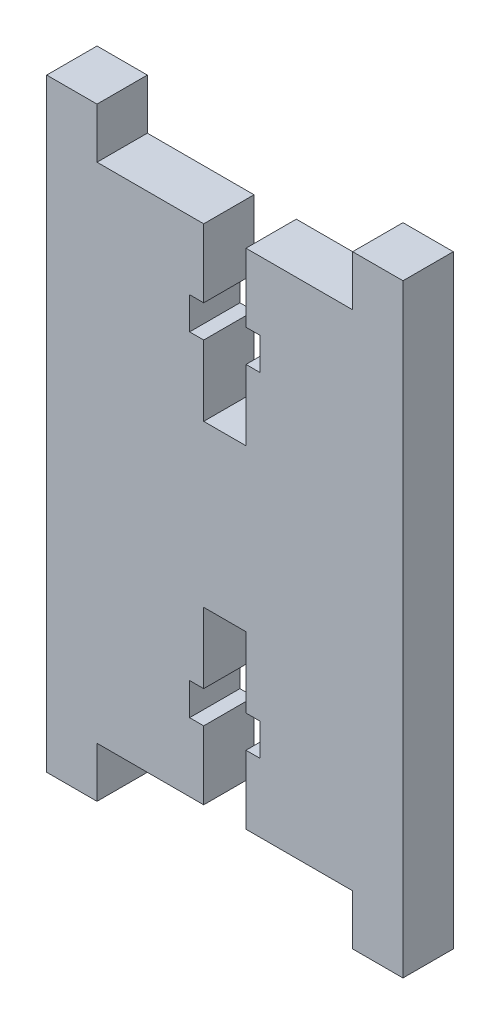
ISO-10303-21;
HEADER;
FILE_DESCRIPTION(('STEP AP214'),'2;1');
FILE_NAME('part.step','',(''),(''),'','','');
FILE_SCHEMA(('AUTOMOTIVE_DESIGN { 1 0 10303 214 1 1 1 1 }'));
ENDSEC;
DATA;
#1=APPLICATION_CONTEXT('core data for automotive mechanical design processes');
#2=APPLICATION_PROTOCOL_DEFINITION('international standard','automotive_design',2000,#1);
#3=PRODUCT_CONTEXT('',#1,'mechanical');
#4=PRODUCT('Part','Part','',(#3));
#5=PRODUCT_RELATED_PRODUCT_CATEGORY('part','',(#4));
#6=PRODUCT_DEFINITION_FORMATION('','',#4);
#7=PRODUCT_DEFINITION_CONTEXT('part definition',#1,'design');
#8=PRODUCT_DEFINITION('design','',#6,#7);
#9=PRODUCT_DEFINITION_SHAPE('','',#8);
#10=(LENGTH_UNIT() NAMED_UNIT(*) SI_UNIT(.MILLI.,.METRE.));
#11=(NAMED_UNIT(*) PLANE_ANGLE_UNIT() SI_UNIT($,.RADIAN.));
#12=(NAMED_UNIT(*) SI_UNIT($,.STERADIAN.) SOLID_ANGLE_UNIT());
#13=UNCERTAINTY_MEASURE_WITH_UNIT(LENGTH_MEASURE(1.E-05),#10,'distance_accuracy_value','');
#14=(GEOMETRIC_REPRESENTATION_CONTEXT(3) GLOBAL_UNCERTAINTY_ASSIGNED_CONTEXT((#13)) GLOBAL_UNIT_ASSIGNED_CONTEXT((#10,
#11,#12)) REPRESENTATION_CONTEXT('',''));
#15=CARTESIAN_POINT('',(0.,0.,0.));
#16=DIRECTION('',(0.,0.,1.));
#17=DIRECTION('',(1.,0.,0.));
#18=AXIS2_PLACEMENT_3D('',#15,#16,#17);
#19=CARTESIAN_POINT('',(-19.8,0.,5.));
#20=DIRECTION('',(-1.,0.,0.));
#21=DIRECTION('',(0.,-1.,0.));
#22=AXIS2_PLACEMENT_3D('',#19,#20,#21);
#23=PLANE('',#22);
#24=DIRECTION('',(0.,1.,0.));
#25=VECTOR('',#24,1.);
#26=CARTESIAN_POINT('',(-19.8,0.,0.));
#27=LINE('',#26,#25);
#28=CARTESIAN_POINT('',(-19.8,0.,0.));
#29=VERTEX_POINT('',#28);
#30=CARTESIAN_POINT('',(-19.8,6.8,0.));
#31=VERTEX_POINT('',#30);
#32=EDGE_CURVE('E390',#29,#31,#27,.T.);
#33=ORIENTED_EDGE('',*,*,#32,.T.);
#34=DIRECTION('',(0.,0.,-1.));
#35=VECTOR('',#34,1.);
#36=CARTESIAN_POINT('',(-19.8,6.8,5.));
#37=LINE('',#36,#35);
#38=CARTESIAN_POINT('',(-19.8,6.8,5.));
#39=VERTEX_POINT('',#38);
#40=EDGE_CURVE('E224',#39,#31,#37,.T.);
#41=ORIENTED_EDGE('',*,*,#40,.F.);
#42=DIRECTION('',(0.,1.,0.));
#43=VECTOR('',#42,1.);
#44=CARTESIAN_POINT('',(-19.8,0.,5.));
#45=LINE('',#44,#43);
#46=CARTESIAN_POINT('',(-19.8,0.,5.));
#47=VERTEX_POINT('',#46);
#48=EDGE_CURVE('E469',#47,#39,#45,.T.);
#49=ORIENTED_EDGE('',*,*,#48,.F.);
#50=DIRECTION('',(0.,0.,-1.));
#51=VECTOR('',#50,1.);
#52=CARTESIAN_POINT('',(-19.8,0.,5.));
#53=LINE('',#52,#51);
#54=EDGE_CURVE('E161',#47,#29,#53,.T.);
#55=ORIENTED_EDGE('',*,*,#54,.T.);
#56=EDGE_LOOP('',(#33,#41,#49,#55));
#57=FACE_BOUND('',#56,.T.);
#58=ADVANCED_FACE('F151',(#57),#23,.F.);
#59=CARTESIAN_POINT('',(0.,6.8,5.));
#60=DIRECTION('',(0.,1.,0.));
#61=DIRECTION('',(0.,0.,1.));
#62=AXIS2_PLACEMENT_3D('',#59,#60,#61);
#63=PLANE('',#62);
#64=DIRECTION('',(1.,0.,0.));
#65=VECTOR('',#64,1.);
#66=CARTESIAN_POINT('',(0.,6.8,0.));
#67=LINE('',#66,#65);
#68=CARTESIAN_POINT('',(-21.2,6.8,0.));
#69=VERTEX_POINT('',#68);
#70=EDGE_CURVE('E387',#69,#31,#67,.T.);
#71=ORIENTED_EDGE('',*,*,#70,.F.);
#72=DIRECTION('',(0.,0.,-1.));
#73=VECTOR('',#72,1.);
#74=CARTESIAN_POINT('',(-21.2,6.8,5.));
#75=LINE('',#74,#73);
#76=CARTESIAN_POINT('',(-21.2,6.8,5.));
#77=VERTEX_POINT('',#76);
#78=EDGE_CURVE('E227',#77,#69,#75,.T.);
#79=ORIENTED_EDGE('',*,*,#78,.F.);
#80=DIRECTION('',(1.,0.,0.));
#81=VECTOR('',#80,1.);
#82=CARTESIAN_POINT('',(0.,6.8,5.));
#83=LINE('',#82,#81);
#84=EDGE_CURVE('E466',#77,#39,#83,.T.);
#85=ORIENTED_EDGE('',*,*,#84,.T.);
#86=ORIENTED_EDGE('',*,*,#40,.T.);
#87=EDGE_LOOP('',(#71,#79,#85,#86));
#88=FACE_BOUND('',#87,.T.);
#89=ADVANCED_FACE('F756',(#88),#63,.T.);
#90=CARTESIAN_POINT('',(-21.2,0.,5.));
#91=DIRECTION('',(-1.,0.,0.));
#92=DIRECTION('',(0.,-1.,0.));
#93=AXIS2_PLACEMENT_3D('',#90,#91,#92);
#94=PLANE('',#93);
#95=DIRECTION('',(0.,1.,0.));
#96=VECTOR('',#95,1.);
#97=CARTESIAN_POINT('',(-21.2,0.,0.));
#98=LINE('',#97,#96);
#99=CARTESIAN_POINT('',(-21.2,10.,0.));
#100=VERTEX_POINT('',#99);
#101=EDGE_CURVE('E384',#69,#100,#98,.T.);
#102=ORIENTED_EDGE('',*,*,#101,.T.);
#103=DIRECTION('',(0.,0.,-1.));
#104=VECTOR('',#103,1.);
#105=CARTESIAN_POINT('',(-21.2,10.,5.));
#106=LINE('',#105,#104);
#107=CARTESIAN_POINT('',(-21.2,10.,5.));
#108=VERTEX_POINT('',#107);
#109=EDGE_CURVE('E230',#108,#100,#106,.T.);
#110=ORIENTED_EDGE('',*,*,#109,.F.);
#111=DIRECTION('',(0.,1.,0.));
#112=VECTOR('',#111,1.);
#113=CARTESIAN_POINT('',(-21.2,0.,5.));
#114=LINE('',#113,#112);
#115=EDGE_CURVE('E463',#77,#108,#114,.T.);
#116=ORIENTED_EDGE('',*,*,#115,.F.);
#117=ORIENTED_EDGE('',*,*,#78,.T.);
#118=EDGE_LOOP('',(#102,#110,#116,#117));
#119=FACE_BOUND('',#118,.T.);
#120=ADVANCED_FACE('F762',(#119),#94,.F.);
#121=CARTESIAN_POINT('',(0.,10.,5.));
#122=DIRECTION('',(0.,1.,0.));
#123=DIRECTION('',(0.,0.,1.));
#124=AXIS2_PLACEMENT_3D('',#121,#122,#123);
#125=PLANE('',#124);
#126=DIRECTION('',(1.,0.,0.));
#127=VECTOR('',#126,1.);
#128=CARTESIAN_POINT('',(0.,10.,0.));
#129=LINE('',#128,#127);
#130=CARTESIAN_POINT('',(-19.8,10.,0.));
#131=VERTEX_POINT('',#130);
#132=EDGE_CURVE('E381',#100,#131,#129,.T.);
#133=ORIENTED_EDGE('',*,*,#132,.T.);
#134=DIRECTION('',(0.,0.,-1.));
#135=VECTOR('',#134,1.);
#136=CARTESIAN_POINT('',(-19.8,10.,5.));
#137=LINE('',#136,#135);
#138=CARTESIAN_POINT('',(-19.8,10.,5.));
#139=VERTEX_POINT('',#138);
#140=EDGE_CURVE('E233',#139,#131,#137,.T.);
#141=ORIENTED_EDGE('',*,*,#140,.F.);
#142=DIRECTION('',(1.,0.,0.));
#143=VECTOR('',#142,1.);
#144=CARTESIAN_POINT('',(0.,10.,5.));
#145=LINE('',#144,#143);
#146=EDGE_CURVE('E460',#108,#139,#145,.T.);
#147=ORIENTED_EDGE('',*,*,#146,.F.);
#148=ORIENTED_EDGE('',*,*,#109,.T.);
#149=EDGE_LOOP('',(#133,#141,#147,#148));
#150=FACE_BOUND('',#149,.T.);
#151=ADVANCED_FACE('F769',(#150),#125,.F.);
#152=CARTESIAN_POINT('',(-19.8,17.,0.));
#153=VERTEX_POINT('',#152);
#154=EDGE_CURVE('E380',#131,#153,#27,.T.);
#155=ORIENTED_EDGE('',*,*,#154,.T.);
#156=DIRECTION('',(0.,0.,-1.));
#157=VECTOR('',#156,1.);
#158=CARTESIAN_POINT('',(-19.8,17.,5.));
#159=LINE('',#158,#157);
#160=CARTESIAN_POINT('',(-19.8,17.,5.));
#161=VERTEX_POINT('',#160);
#162=EDGE_CURVE('E236',#161,#153,#159,.T.);
#163=ORIENTED_EDGE('',*,*,#162,.F.);
#164=EDGE_CURVE('E459',#139,#161,#45,.T.);
#165=ORIENTED_EDGE('',*,*,#164,.F.);
#166=ORIENTED_EDGE('',*,*,#140,.T.);
#167=EDGE_LOOP('',(#155,#163,#165,#166));
#168=FACE_BOUND('',#167,.T.);
#169=ADVANCED_FACE('F758',(#168),#23,.F.);
#170=CARTESIAN_POINT('',(0.,17.,5.));
#171=DIRECTION('',(0.,1.,0.));
#172=DIRECTION('',(0.,0.,1.));
#173=AXIS2_PLACEMENT_3D('',#170,#171,#172);
#174=PLANE('',#173);
#175=DIRECTION('',(1.,0.,0.));
#176=VECTOR('',#175,1.);
#177=CARTESIAN_POINT('',(0.,17.,0.));
#178=LINE('',#177,#176);
#179=CARTESIAN_POINT('',(-15.6,17.,0.));
#180=VERTEX_POINT('',#179);
#181=EDGE_CURVE('E376',#153,#180,#178,.T.);
#182=ORIENTED_EDGE('',*,*,#181,.T.);
#183=DIRECTION('',(0.,0.,-1.));
#184=VECTOR('',#183,1.);
#185=CARTESIAN_POINT('',(-15.6,17.,5.));
#186=LINE('',#185,#184);
#187=CARTESIAN_POINT('',(-15.6,17.,5.));
#188=VERTEX_POINT('',#187);
#189=EDGE_CURVE('E239',#188,#180,#186,.T.);
#190=ORIENTED_EDGE('',*,*,#189,.F.);
#191=DIRECTION('',(1.,0.,0.));
#192=VECTOR('',#191,1.);
#193=CARTESIAN_POINT('',(0.,17.,5.));
#194=LINE('',#193,#192);
#195=EDGE_CURVE('E455',#161,#188,#194,.T.);
#196=ORIENTED_EDGE('',*,*,#195,.F.);
#197=ORIENTED_EDGE('',*,*,#162,.T.);
#198=EDGE_LOOP('',(#182,#190,#196,#197));
#199=FACE_BOUND('',#198,.T.);
#200=ADVANCED_FACE('F768',(#199),#174,.F.);
#201=CARTESIAN_POINT('',(-15.6,0.,5.));
#202=DIRECTION('',(-1.,0.,0.));
#203=DIRECTION('',(0.,-1.,0.));
#204=AXIS2_PLACEMENT_3D('',#201,#202,#203);
#205=PLANE('',#204);
#206=DIRECTION('',(0.,1.,0.));
#207=VECTOR('',#206,1.);
#208=CARTESIAN_POINT('',(-15.6,0.,0.));
#209=LINE('',#208,#207);
#210=CARTESIAN_POINT('',(-15.6,10.,0.));
#211=VERTEX_POINT('',#210);
#212=EDGE_CURVE('E373',#211,#180,#209,.T.);
#213=ORIENTED_EDGE('',*,*,#212,.F.);
#214=DIRECTION('',(0.,0.,-1.));
#215=VECTOR('',#214,1.);
#216=CARTESIAN_POINT('',(-15.6,10.,5.));
#217=LINE('',#216,#215);
#218=CARTESIAN_POINT('',(-15.6,10.,5.));
#219=VERTEX_POINT('',#218);
#220=EDGE_CURVE('E242',#219,#211,#217,.T.);
#221=ORIENTED_EDGE('',*,*,#220,.F.);
#222=DIRECTION('',(0.,1.,0.));
#223=VECTOR('',#222,1.);
#224=CARTESIAN_POINT('',(-15.6,0.,5.));
#225=LINE('',#224,#223);
#226=EDGE_CURVE('E452',#219,#188,#225,.T.);
#227=ORIENTED_EDGE('',*,*,#226,.T.);
#228=ORIENTED_EDGE('',*,*,#189,.T.);
#229=EDGE_LOOP('',(#213,#221,#227,#228));
#230=FACE_BOUND('',#229,.T.);
#231=ADVANCED_FACE('F775',(#230),#205,.T.);
#232=CARTESIAN_POINT('',(-14.2,10.,0.));
#233=VERTEX_POINT('',#232);
#234=EDGE_CURVE('E372',#211,#233,#129,.T.);
#235=ORIENTED_EDGE('',*,*,#234,.T.);
#236=DIRECTION('',(0.,0.,-1.));
#237=VECTOR('',#236,1.);
#238=CARTESIAN_POINT('',(-14.2,10.,5.));
#239=LINE('',#238,#237);
#240=CARTESIAN_POINT('',(-14.2,10.,5.));
#241=VERTEX_POINT('',#240);
#242=EDGE_CURVE('E245',#241,#233,#239,.T.);
#243=ORIENTED_EDGE('',*,*,#242,.F.);
#244=EDGE_CURVE('E451',#219,#241,#145,.T.);
#245=ORIENTED_EDGE('',*,*,#244,.F.);
#246=ORIENTED_EDGE('',*,*,#220,.T.);
#247=EDGE_LOOP('',(#235,#243,#245,#246));
#248=FACE_BOUND('',#247,.T.);
#249=ADVANCED_FACE('F651',(#248),#125,.F.);
#250=CARTESIAN_POINT('',(-14.2,0.,5.));
#251=DIRECTION('',(-1.,0.,0.));
#252=DIRECTION('',(0.,-1.,0.));
#253=AXIS2_PLACEMENT_3D('',#250,#251,#252);
#254=PLANE('',#253);
#255=DIRECTION('',(0.,1.,0.));
#256=VECTOR('',#255,1.);
#257=CARTESIAN_POINT('',(-14.2,0.,0.));
#258=LINE('',#257,#256);
#259=CARTESIAN_POINT('',(-14.2,6.8,0.));
#260=VERTEX_POINT('',#259);
#261=EDGE_CURVE('E368',#260,#233,#258,.T.);
#262=ORIENTED_EDGE('',*,*,#261,.F.);
#263=DIRECTION('',(0.,0.,-1.));
#264=VECTOR('',#263,1.);
#265=CARTESIAN_POINT('',(-14.2,6.8,5.));
#266=LINE('',#265,#264);
#267=CARTESIAN_POINT('',(-14.2,6.8,5.));
#268=VERTEX_POINT('',#267);
#269=EDGE_CURVE('E248',#268,#260,#266,.T.);
#270=ORIENTED_EDGE('',*,*,#269,.F.);
#271=DIRECTION('',(0.,1.,0.));
#272=VECTOR('',#271,1.);
#273=CARTESIAN_POINT('',(-14.2,0.,5.));
#274=LINE('',#273,#272);
#275=EDGE_CURVE('E447',#268,#241,#274,.T.);
#276=ORIENTED_EDGE('',*,*,#275,.T.);
#277=ORIENTED_EDGE('',*,*,#242,.T.);
#278=EDGE_LOOP('',(#262,#270,#276,#277));
#279=FACE_BOUND('',#278,.T.);
#280=ADVANCED_FACE('F654',(#279),#254,.T.);
#281=CARTESIAN_POINT('',(-15.6,6.8,0.));
#282=VERTEX_POINT('',#281);
#283=EDGE_CURVE('E371',#282,#260,#67,.T.);
#284=ORIENTED_EDGE('',*,*,#283,.F.);
#285=DIRECTION('',(0.,0.,-1.));
#286=VECTOR('',#285,1.);
#287=CARTESIAN_POINT('',(-15.6,6.8,5.));
#288=LINE('',#287,#286);
#289=CARTESIAN_POINT('',(-15.6,6.8,5.));
#290=VERTEX_POINT('',#289);
#291=EDGE_CURVE('E251',#290,#282,#288,.T.);
#292=ORIENTED_EDGE('',*,*,#291,.F.);
#293=EDGE_CURVE('E450',#290,#268,#83,.T.);
#294=ORIENTED_EDGE('',*,*,#293,.T.);
#295=ORIENTED_EDGE('',*,*,#269,.T.);
#296=EDGE_LOOP('',(#284,#292,#294,#295));
#297=FACE_BOUND('',#296,.T.);
#298=ADVANCED_FACE('F493',(#297),#63,.T.);
#299=CARTESIAN_POINT('',(-15.6,0.,0.));
#300=VERTEX_POINT('',#299);
#301=EDGE_CURVE('E377',#300,#282,#209,.T.);
#302=ORIENTED_EDGE('',*,*,#301,.F.);
#303=DIRECTION('',(0.,0.,-1.));
#304=VECTOR('',#303,1.);
#305=CARTESIAN_POINT('',(-15.6,0.,5.));
#306=LINE('',#305,#304);
#307=CARTESIAN_POINT('',(-15.6,0.,5.));
#308=VERTEX_POINT('',#307);
#309=EDGE_CURVE('E254',#308,#300,#306,.T.);
#310=ORIENTED_EDGE('',*,*,#309,.F.);
#311=EDGE_CURVE('E456',#308,#290,#225,.T.);
#312=ORIENTED_EDGE('',*,*,#311,.T.);
#313=ORIENTED_EDGE('',*,*,#291,.T.);
#314=EDGE_LOOP('',(#302,#310,#312,#313));
#315=FACE_BOUND('',#314,.T.);
#316=ADVANCED_FACE('F791',(#315),#205,.T.);
#317=CARTESIAN_POINT('',(0.,0.,5.));
#318=DIRECTION('',(0.,1.,0.));
#319=DIRECTION('',(0.,0.,1.));
#320=AXIS2_PLACEMENT_3D('',#317,#318,#319);
#321=PLANE('',#320);
#322=DIRECTION('',(1.,0.,0.));
#323=VECTOR('',#322,1.);
#324=CARTESIAN_POINT('',(0.,0.,0.));
#325=LINE('',#324,#323);
#326=CARTESIAN_POINT('',(-5.,0.,0.));
#327=VERTEX_POINT('',#326);
#328=EDGE_CURVE('E367',#300,#327,#325,.T.);
#329=ORIENTED_EDGE('',*,*,#328,.T.);
#330=DIRECTION('',(0.,0.,-1.));
#331=VECTOR('',#330,1.);
#332=CARTESIAN_POINT('',(-5.,0.,5.));
#333=LINE('',#332,#331);
#334=CARTESIAN_POINT('',(-5.,0.,5.));
#335=VERTEX_POINT('',#334);
#336=EDGE_CURVE('E257',#335,#327,#333,.T.);
#337=ORIENTED_EDGE('',*,*,#336,.F.);
#338=DIRECTION('',(1.,0.,0.));
#339=VECTOR('',#338,1.);
#340=CARTESIAN_POINT('',(0.,0.,5.));
#341=LINE('',#340,#339);
#342=EDGE_CURVE('E446',#308,#335,#341,.T.);
#343=ORIENTED_EDGE('',*,*,#342,.F.);
#344=ORIENTED_EDGE('',*,*,#309,.T.);
#345=EDGE_LOOP('',(#329,#337,#343,#344));
#346=FACE_BOUND('',#345,.T.);
#347=ADVANCED_FACE('F660',(#346),#321,.F.);
#348=CARTESIAN_POINT('',(-5.,0.,5.));
#349=DIRECTION('',(1.,0.,0.));
#350=DIRECTION('',(0.,0.,-1.));
#351=AXIS2_PLACEMENT_3D('',#348,#349,#350);
#352=PLANE('',#351);
#353=DIRECTION('',(0.,-1.,0.));
#354=VECTOR('',#353,1.);
#355=CARTESIAN_POINT('',(-5.,0.,0.));
#356=LINE('',#355,#354);
#357=CARTESIAN_POINT('',(-5.,-5.,0.));
#358=VERTEX_POINT('',#357);
#359=EDGE_CURVE('E364',#327,#358,#356,.T.);
#360=ORIENTED_EDGE('',*,*,#359,.T.);
#361=DIRECTION('',(0.,0.,-1.));
#362=VECTOR('',#361,1.);
#363=CARTESIAN_POINT('',(-5.,-5.,5.));
#364=LINE('',#363,#362);
#365=CARTESIAN_POINT('',(-5.,-5.,5.));
#366=VERTEX_POINT('',#365);
#367=EDGE_CURVE('E260',#366,#358,#364,.T.);
#368=ORIENTED_EDGE('',*,*,#367,.F.);
#369=DIRECTION('',(0.,-1.,0.));
#370=VECTOR('',#369,1.);
#371=CARTESIAN_POINT('',(-5.,0.,5.));
#372=LINE('',#371,#370);
#373=EDGE_CURVE('E443',#335,#366,#372,.T.);
#374=ORIENTED_EDGE('',*,*,#373,.F.);
#375=ORIENTED_EDGE('',*,*,#336,.T.);
#376=EDGE_LOOP('',(#360,#368,#374,#375));
#377=FACE_BOUND('',#376,.T.);
#378=ADVANCED_FACE('F664',(#377),#352,.F.);
#379=CARTESIAN_POINT('',(0.,-5.,5.));
#380=DIRECTION('',(0.,-1.,0.));
#381=DIRECTION('',(0.,0.,-1.));
#382=AXIS2_PLACEMENT_3D('',#379,#380,#381);
#383=PLANE('',#382);
#384=DIRECTION('',(-1.,0.,0.));
#385=VECTOR('',#384,1.);
#386=CARTESIAN_POINT('',(0.,-5.,0.));
#387=LINE('',#386,#385);
#388=CARTESIAN_POINT('',(0.,-5.,0.));
#389=VERTEX_POINT('',#388);
#390=EDGE_CURVE('E361',#389,#358,#387,.T.);
#391=ORIENTED_EDGE('',*,*,#390,.F.);
#392=DIRECTION('',(0.,0.,-1.));
#393=VECTOR('',#392,1.);
#394=CARTESIAN_POINT('',(0.,-5.,5.));
#395=LINE('',#394,#393);
#396=CARTESIAN_POINT('',(0.,-5.,5.));
#397=VERTEX_POINT('',#396);
#398=EDGE_CURVE('E263',#397,#389,#395,.T.);
#399=ORIENTED_EDGE('',*,*,#398,.F.);
#400=DIRECTION('',(-1.,0.,0.));
#401=VECTOR('',#400,1.);
#402=CARTESIAN_POINT('',(0.,-5.,5.));
#403=LINE('',#402,#401);
#404=EDGE_CURVE('E440',#397,#366,#403,.T.);
#405=ORIENTED_EDGE('',*,*,#404,.T.);
#406=ORIENTED_EDGE('',*,*,#367,.T.);
#407=EDGE_LOOP('',(#391,#399,#405,#406));
#408=FACE_BOUND('',#407,.T.);
#409=ADVANCED_FACE('F670',(#408),#383,.T.);
#410=CARTESIAN_POINT('',(0.,0.,5.));
#411=DIRECTION('',(1.,0.,0.));
#412=DIRECTION('',(0.,0.,-1.));
#413=AXIS2_PLACEMENT_3D('',#410,#411,#412);
#414=PLANE('',#413);
#415=DIRECTION('',(0.,-1.,0.));
#416=VECTOR('',#415,1.);
#417=CARTESIAN_POINT('',(0.,0.,0.));
#418=LINE('',#417,#416);
#419=CARTESIAN_POINT('',(0.,55.,0.));
#420=VERTEX_POINT('',#419);
#421=EDGE_CURVE('E358',#420,#389,#418,.T.);
#422=ORIENTED_EDGE('',*,*,#421,.F.);
#423=DIRECTION('',(0.,0.,-1.));
#424=VECTOR('',#423,1.);
#425=CARTESIAN_POINT('',(0.,55.,5.));
#426=LINE('',#425,#424);
#427=CARTESIAN_POINT('',(0.,55.,5.));
#428=VERTEX_POINT('',#427);
#429=EDGE_CURVE('E266',#428,#420,#426,.T.);
#430=ORIENTED_EDGE('',*,*,#429,.F.);
#431=DIRECTION('',(0.,-1.,0.));
#432=VECTOR('',#431,1.);
#433=CARTESIAN_POINT('',(0.,0.,5.));
#434=LINE('',#433,#432);
#435=EDGE_CURVE('E437',#428,#397,#434,.T.);
#436=ORIENTED_EDGE('',*,*,#435,.T.);
#437=ORIENTED_EDGE('',*,*,#398,.T.);
#438=EDGE_LOOP('',(#422,#430,#436,#437));
#439=FACE_BOUND('',#438,.T.);
#440=ADVANCED_FACE('F674',(#439),#414,.T.);
#441=CARTESIAN_POINT('',(0.,55.,5.));
#442=DIRECTION('',(0.,-1.,0.));
#443=DIRECTION('',(0.,0.,-1.));
#444=AXIS2_PLACEMENT_3D('',#441,#442,#443);
#445=PLANE('',#444);
#446=DIRECTION('',(-1.,0.,0.));
#447=VECTOR('',#446,1.);
#448=CARTESIAN_POINT('',(0.,55.,0.));
#449=LINE('',#448,#447);
#450=CARTESIAN_POINT('',(-5.,55.,0.));
#451=VERTEX_POINT('',#450);
#452=EDGE_CURVE('E355',#420,#451,#449,.T.);
#453=ORIENTED_EDGE('',*,*,#452,.T.);
#454=DIRECTION('',(0.,0.,-1.));
#455=VECTOR('',#454,1.);
#456=CARTESIAN_POINT('',(-5.,55.,5.));
#457=LINE('',#456,#455);
#458=CARTESIAN_POINT('',(-5.,55.,5.));
#459=VERTEX_POINT('',#458);
#460=EDGE_CURVE('E269',#459,#451,#457,.T.);
#461=ORIENTED_EDGE('',*,*,#460,.F.);
#462=DIRECTION('',(-1.,0.,0.));
#463=VECTOR('',#462,1.);
#464=CARTESIAN_POINT('',(0.,55.,5.));
#465=LINE('',#464,#463);
#466=EDGE_CURVE('E434',#428,#459,#465,.T.);
#467=ORIENTED_EDGE('',*,*,#466,.F.);
#468=ORIENTED_EDGE('',*,*,#429,.T.);
#469=EDGE_LOOP('',(#453,#461,#467,#468));
#470=FACE_BOUND('',#469,.T.);
#471=ADVANCED_FACE('F678',(#470),#445,.F.);
#472=CARTESIAN_POINT('',(-5.,0.,5.));
#473=DIRECTION('',(-1.,0.,0.));
#474=DIRECTION('',(0.,0.,1.));
#475=AXIS2_PLACEMENT_3D('',#472,#473,#474);
#476=PLANE('',#475);
#477=DIRECTION('',(0.,1.,0.));
#478=VECTOR('',#477,1.);
#479=CARTESIAN_POINT('',(-5.,0.,0.));
#480=LINE('',#479,#478);
#481=CARTESIAN_POINT('',(-5.,50.,0.));
#482=VERTEX_POINT('',#481);
#483=EDGE_CURVE('E352',#482,#451,#480,.T.);
#484=ORIENTED_EDGE('',*,*,#483,.F.);
#485=DIRECTION('',(0.,0.,-1.));
#486=VECTOR('',#485,1.);
#487=CARTESIAN_POINT('',(-5.,50.,5.));
#488=LINE('',#487,#486);
#489=CARTESIAN_POINT('',(-5.,50.,5.));
#490=VERTEX_POINT('',#489);
#491=EDGE_CURVE('E272',#490,#482,#488,.T.);
#492=ORIENTED_EDGE('',*,*,#491,.F.);
#493=DIRECTION('',(0.,1.,0.));
#494=VECTOR('',#493,1.);
#495=CARTESIAN_POINT('',(-5.,0.,5.));
#496=LINE('',#495,#494);
#497=EDGE_CURVE('E431',#490,#459,#496,.T.);
#498=ORIENTED_EDGE('',*,*,#497,.T.);
#499=ORIENTED_EDGE('',*,*,#460,.T.);
#500=EDGE_LOOP('',(#484,#492,#498,#499));
#501=FACE_BOUND('',#500,.T.);
#502=ADVANCED_FACE('F745',(#501),#476,.T.);
#503=CARTESIAN_POINT('',(0.,50.,5.));
#504=DIRECTION('',(0.,1.,0.));
#505=DIRECTION('',(0.,0.,1.));
#506=AXIS2_PLACEMENT_3D('',#503,#504,#505);
#507=PLANE('',#506);
#508=DIRECTION('',(1.,0.,0.));
#509=VECTOR('',#508,1.);
#510=CARTESIAN_POINT('',(0.,50.,0.));
#511=LINE('',#510,#509);
#512=CARTESIAN_POINT('',(-15.6,50.,0.));
#513=VERTEX_POINT('',#512);
#514=EDGE_CURVE('E349',#513,#482,#511,.T.);
#515=ORIENTED_EDGE('',*,*,#514,.F.);
#516=DIRECTION('',(0.,0.,-1.));
#517=VECTOR('',#516,1.);
#518=CARTESIAN_POINT('',(-15.6,50.,5.));
#519=LINE('',#518,#517);
#520=CARTESIAN_POINT('',(-15.6,50.,5.));
#521=VERTEX_POINT('',#520);
#522=EDGE_CURVE('E275',#521,#513,#519,.T.);
#523=ORIENTED_EDGE('',*,*,#522,.F.);
#524=DIRECTION('',(1.,0.,0.));
#525=VECTOR('',#524,1.);
#526=CARTESIAN_POINT('',(0.,50.,5.));
#527=LINE('',#526,#525);
#528=EDGE_CURVE('E428',#521,#490,#527,.T.);
#529=ORIENTED_EDGE('',*,*,#528,.T.);
#530=ORIENTED_EDGE('',*,*,#491,.T.);
#531=EDGE_LOOP('',(#515,#523,#529,#530));
#532=FACE_BOUND('',#531,.T.);
#533=ADVANCED_FACE('F684',(#532),#507,.T.);
#534=CARTESIAN_POINT('',(-15.6,0.,5.));
#535=DIRECTION('',(1.,0.,0.));
#536=DIRECTION('',(0.,1.,0.));
#537=AXIS2_PLACEMENT_3D('',#534,#535,#536);
#538=PLANE('',#537);
#539=DIRECTION('',(0.,-1.,0.));
#540=VECTOR('',#539,1.);
#541=CARTESIAN_POINT('',(-15.6,0.,0.));
#542=LINE('',#541,#540);
#543=CARTESIAN_POINT('',(-15.6,43.2,0.));
#544=VERTEX_POINT('',#543);
#545=EDGE_CURVE('E346',#513,#544,#542,.T.);
#546=ORIENTED_EDGE('',*,*,#545,.T.);
#547=DIRECTION('',(0.,0.,-1.));
#548=VECTOR('',#547,1.);
#549=CARTESIAN_POINT('',(-15.6,43.2,5.));
#550=LINE('',#549,#548);
#551=CARTESIAN_POINT('',(-15.6,43.2,5.));
#552=VERTEX_POINT('',#551);
#553=EDGE_CURVE('E278',#552,#544,#550,.T.);
#554=ORIENTED_EDGE('',*,*,#553,.F.);
#555=DIRECTION('',(0.,-1.,0.));
#556=VECTOR('',#555,1.);
#557=CARTESIAN_POINT('',(-15.6,0.,5.));
#558=LINE('',#557,#556);
#559=EDGE_CURVE('E425',#521,#552,#558,.T.);
#560=ORIENTED_EDGE('',*,*,#559,.F.);
#561=ORIENTED_EDGE('',*,*,#522,.T.);
#562=EDGE_LOOP('',(#546,#554,#560,#561));
#563=FACE_BOUND('',#562,.T.);
#564=ADVANCED_FACE('F690',(#563),#538,.F.);
#565=CARTESIAN_POINT('',(0.,43.2,5.));
#566=DIRECTION('',(0.,1.,0.));
#567=DIRECTION('',(0.,0.,1.));
#568=AXIS2_PLACEMENT_3D('',#565,#566,#567);
#569=PLANE('',#568);
#570=DIRECTION('',(1.,0.,0.));
#571=VECTOR('',#570,1.);
#572=CARTESIAN_POINT('',(0.,43.2,0.));
#573=LINE('',#572,#571);
#574=CARTESIAN_POINT('',(-14.2,43.2,0.));
#575=VERTEX_POINT('',#574);
#576=EDGE_CURVE('E343',#544,#575,#573,.T.);
#577=ORIENTED_EDGE('',*,*,#576,.T.);
#578=DIRECTION('',(0.,0.,-1.));
#579=VECTOR('',#578,1.);
#580=CARTESIAN_POINT('',(-14.2,43.2,5.));
#581=LINE('',#580,#579);
#582=CARTESIAN_POINT('',(-14.2,43.2,5.));
#583=VERTEX_POINT('',#582);
#584=EDGE_CURVE('E281',#583,#575,#581,.T.);
#585=ORIENTED_EDGE('',*,*,#584,.F.);
#586=DIRECTION('',(1.,0.,0.));
#587=VECTOR('',#586,1.);
#588=CARTESIAN_POINT('',(0.,43.2,5.));
#589=LINE('',#588,#587);
#590=EDGE_CURVE('E422',#552,#583,#589,.T.);
#591=ORIENTED_EDGE('',*,*,#590,.F.);
#592=ORIENTED_EDGE('',*,*,#553,.T.);
#593=EDGE_LOOP('',(#577,#585,#591,#592));
#594=FACE_BOUND('',#593,.T.);
#595=ADVANCED_FACE('F697',(#594),#569,.F.);
#596=CARTESIAN_POINT('',(-14.2,0.,5.));
#597=DIRECTION('',(1.,0.,0.));
#598=DIRECTION('',(0.,1.,0.));
#599=AXIS2_PLACEMENT_3D('',#596,#597,#598);
#600=PLANE('',#599);
#601=DIRECTION('',(0.,-1.,0.));
#602=VECTOR('',#601,1.);
#603=CARTESIAN_POINT('',(-14.2,0.,0.));
#604=LINE('',#603,#602);
#605=CARTESIAN_POINT('',(-14.2,40.,0.));
#606=VERTEX_POINT('',#605);
#607=EDGE_CURVE('E340',#575,#606,#604,.T.);
#608=ORIENTED_EDGE('',*,*,#607,.T.);
#609=DIRECTION('',(0.,0.,-1.));
#610=VECTOR('',#609,1.);
#611=CARTESIAN_POINT('',(-14.2,40.,5.));
#612=LINE('',#611,#610);
#613=CARTESIAN_POINT('',(-14.2,40.,5.));
#614=VERTEX_POINT('',#613);
#615=EDGE_CURVE('E284',#614,#606,#612,.T.);
#616=ORIENTED_EDGE('',*,*,#615,.F.);
#617=DIRECTION('',(0.,-1.,0.));
#618=VECTOR('',#617,1.);
#619=CARTESIAN_POINT('',(-14.2,0.,5.));
#620=LINE('',#619,#618);
#621=EDGE_CURVE('E419',#583,#614,#620,.T.);
#622=ORIENTED_EDGE('',*,*,#621,.F.);
#623=ORIENTED_EDGE('',*,*,#584,.T.);
#624=EDGE_LOOP('',(#608,#616,#622,#623));
#625=FACE_BOUND('',#624,.T.);
#626=ADVANCED_FACE('F701',(#625),#600,.F.);
#627=CARTESIAN_POINT('',(0.,40.,5.));
#628=DIRECTION('',(0.,1.,0.));
#629=DIRECTION('',(0.,0.,1.));
#630=AXIS2_PLACEMENT_3D('',#627,#628,#629);
#631=PLANE('',#630);
#632=DIRECTION('',(1.,0.,0.));
#633=VECTOR('',#632,1.);
#634=CARTESIAN_POINT('',(0.,40.,0.));
#635=LINE('',#634,#633);
#636=CARTESIAN_POINT('',(-15.6,40.,0.));
#637=VERTEX_POINT('',#636);
#638=EDGE_CURVE('E337',#637,#606,#635,.T.);
#639=ORIENTED_EDGE('',*,*,#638,.F.);
#640=DIRECTION('',(0.,0.,-1.));
#641=VECTOR('',#640,1.);
#642=CARTESIAN_POINT('',(-15.6,40.,5.));
#643=LINE('',#642,#641);
#644=CARTESIAN_POINT('',(-15.6,40.,5.));
#645=VERTEX_POINT('',#644);
#646=EDGE_CURVE('E287',#645,#637,#643,.T.);
#647=ORIENTED_EDGE('',*,*,#646,.F.);
#648=DIRECTION('',(1.,0.,0.));
#649=VECTOR('',#648,1.);
#650=CARTESIAN_POINT('',(0.,40.,5.));
#651=LINE('',#650,#649);
#652=EDGE_CURVE('E416',#645,#614,#651,.T.);
#653=ORIENTED_EDGE('',*,*,#652,.T.);
#654=ORIENTED_EDGE('',*,*,#615,.T.);
#655=EDGE_LOOP('',(#639,#647,#653,#654));
#656=FACE_BOUND('',#655,.T.);
#657=ADVANCED_FACE('F704',(#656),#631,.T.);
#658=CARTESIAN_POINT('',(-15.6,33.,0.));
#659=VERTEX_POINT('',#658);
#660=EDGE_CURVE('E336',#637,#659,#542,.T.);
#661=ORIENTED_EDGE('',*,*,#660,.T.);
#662=DIRECTION('',(0.,0.,-1.));
#663=VECTOR('',#662,1.);
#664=CARTESIAN_POINT('',(-15.6,33.,5.));
#665=LINE('',#664,#663);
#666=CARTESIAN_POINT('',(-15.6,33.,5.));
#667=VERTEX_POINT('',#666);
#668=EDGE_CURVE('E290',#667,#659,#665,.T.);
#669=ORIENTED_EDGE('',*,*,#668,.F.);
#670=EDGE_CURVE('E415',#645,#667,#558,.T.);
#671=ORIENTED_EDGE('',*,*,#670,.F.);
#672=ORIENTED_EDGE('',*,*,#646,.T.);
#673=EDGE_LOOP('',(#661,#669,#671,#672));
#674=FACE_BOUND('',#673,.T.);
#675=ADVANCED_FACE('F711',(#674),#538,.F.);
#676=CARTESIAN_POINT('',(0.,33.,5.));
#677=DIRECTION('',(0.,1.,0.));
#678=DIRECTION('',(0.,0.,1.));
#679=AXIS2_PLACEMENT_3D('',#676,#677,#678);
#680=PLANE('',#679);
#681=DIRECTION('',(1.,0.,0.));
#682=VECTOR('',#681,1.);
#683=CARTESIAN_POINT('',(0.,33.,0.));
#684=LINE('',#683,#682);
#685=CARTESIAN_POINT('',(-19.8,33.,0.));
#686=VERTEX_POINT('',#685);
#687=EDGE_CURVE('E332',#686,#659,#684,.T.);
#688=ORIENTED_EDGE('',*,*,#687,.F.);
#689=DIRECTION('',(0.,0.,-1.));
#690=VECTOR('',#689,1.);
#691=CARTESIAN_POINT('',(-19.8,33.,5.));
#692=LINE('',#691,#690);
#693=CARTESIAN_POINT('',(-19.8,33.,5.));
#694=VERTEX_POINT('',#693);
#695=EDGE_CURVE('E293',#694,#686,#692,.T.);
#696=ORIENTED_EDGE('',*,*,#695,.F.);
#697=DIRECTION('',(1.,0.,0.));
#698=VECTOR('',#697,1.);
#699=CARTESIAN_POINT('',(0.,33.,5.));
#700=LINE('',#699,#698);
#701=EDGE_CURVE('E411',#694,#667,#700,.T.);
#702=ORIENTED_EDGE('',*,*,#701,.T.);
#703=ORIENTED_EDGE('',*,*,#668,.T.);
#704=EDGE_LOOP('',(#688,#696,#702,#703));
#705=FACE_BOUND('',#704,.T.);
#706=ADVANCED_FACE('F715',(#705),#680,.T.);
#707=CARTESIAN_POINT('',(-19.8,0.,5.));
#708=DIRECTION('',(1.,0.,0.));
#709=DIRECTION('',(0.,1.,0.));
#710=AXIS2_PLACEMENT_3D('',#707,#708,#709);
#711=PLANE('',#710);
#712=DIRECTION('',(0.,-1.,0.));
#713=VECTOR('',#712,1.);
#714=CARTESIAN_POINT('',(-19.8,0.,0.));
#715=LINE('',#714,#713);
#716=CARTESIAN_POINT('',(-19.8,40.,0.));
#717=VERTEX_POINT('',#716);
#718=EDGE_CURVE('E329',#717,#686,#715,.T.);
#719=ORIENTED_EDGE('',*,*,#718,.F.);
#720=DIRECTION('',(0.,0.,-1.));
#721=VECTOR('',#720,1.);
#722=CARTESIAN_POINT('',(-19.8,40.,5.));
#723=LINE('',#722,#721);
#724=CARTESIAN_POINT('',(-19.8,40.,5.));
#725=VERTEX_POINT('',#724);
#726=EDGE_CURVE('E296',#725,#717,#723,.T.);
#727=ORIENTED_EDGE('',*,*,#726,.F.);
#728=DIRECTION('',(0.,-1.,0.));
#729=VECTOR('',#728,1.);
#730=CARTESIAN_POINT('',(-19.8,0.,5.));
#731=LINE('',#730,#729);
#732=EDGE_CURVE('E408',#725,#694,#731,.T.);
#733=ORIENTED_EDGE('',*,*,#732,.T.);
#734=ORIENTED_EDGE('',*,*,#695,.T.);
#735=EDGE_LOOP('',(#719,#727,#733,#734));
#736=FACE_BOUND('',#735,.T.);
#737=ADVANCED_FACE('F718',(#736),#711,.T.);
#738=CARTESIAN_POINT('',(-21.2,40.,0.));
#739=VERTEX_POINT('',#738);
#740=EDGE_CURVE('E328',#739,#717,#635,.T.);
#741=ORIENTED_EDGE('',*,*,#740,.F.);
#742=DIRECTION('',(0.,0.,-1.));
#743=VECTOR('',#742,1.);
#744=CARTESIAN_POINT('',(-21.2,40.,5.));
#745=LINE('',#744,#743);
#746=CARTESIAN_POINT('',(-21.2,40.,5.));
#747=VERTEX_POINT('',#746);
#748=EDGE_CURVE('E299',#747,#739,#745,.T.);
#749=ORIENTED_EDGE('',*,*,#748,.F.);
#750=EDGE_CURVE('E407',#747,#725,#651,.T.);
#751=ORIENTED_EDGE('',*,*,#750,.T.);
#752=ORIENTED_EDGE('',*,*,#726,.T.);
#753=EDGE_LOOP('',(#741,#749,#751,#752));
#754=FACE_BOUND('',#753,.T.);
#755=ADVANCED_FACE('F725',(#754),#631,.T.);
#756=CARTESIAN_POINT('',(-21.2000000000001,0.,5.));
#757=DIRECTION('',(1.,0.,0.));
#758=DIRECTION('',(0.,1.,0.));
#759=AXIS2_PLACEMENT_3D('',#756,#757,#758);
#760=PLANE('',#759);
#761=DIRECTION('',(0.,-1.,0.));
#762=VECTOR('',#761,1.);
#763=CARTESIAN_POINT('',(-21.2000000000001,0.,0.));
#764=LINE('',#763,#762);
#765=CARTESIAN_POINT('',(-21.2,43.2,0.));
#766=VERTEX_POINT('',#765);
#767=EDGE_CURVE('E324',#766,#739,#764,.T.);
#768=ORIENTED_EDGE('',*,*,#767,.F.);
#769=DIRECTION('',(0.,0.,-1.));
#770=VECTOR('',#769,1.);
#771=CARTESIAN_POINT('',(-21.2,43.2,5.));
#772=LINE('',#771,#770);
#773=CARTESIAN_POINT('',(-21.2,43.2,5.));
#774=VERTEX_POINT('',#773);
#775=EDGE_CURVE('E302',#774,#766,#772,.T.);
#776=ORIENTED_EDGE('',*,*,#775,.F.);
#777=DIRECTION('',(0.,-1.,0.));
#778=VECTOR('',#777,1.);
#779=CARTESIAN_POINT('',(-21.2000000000001,0.,5.));
#780=LINE('',#779,#778);
#781=EDGE_CURVE('E403',#774,#747,#780,.T.);
#782=ORIENTED_EDGE('',*,*,#781,.T.);
#783=ORIENTED_EDGE('',*,*,#748,.T.);
#784=EDGE_LOOP('',(#768,#776,#782,#783));
#785=FACE_BOUND('',#784,.T.);
#786=ADVANCED_FACE('F728',(#785),#760,.T.);
#787=CARTESIAN_POINT('',(-19.8,43.2,0.));
#788=VERTEX_POINT('',#787);
#789=EDGE_CURVE('E327',#766,#788,#573,.T.);
#790=ORIENTED_EDGE('',*,*,#789,.T.);
#791=DIRECTION('',(0.,0.,-1.));
#792=VECTOR('',#791,1.);
#793=CARTESIAN_POINT('',(-19.8,43.2,5.));
#794=LINE('',#793,#792);
#795=CARTESIAN_POINT('',(-19.8,43.2,5.));
#796=VERTEX_POINT('',#795);
#797=EDGE_CURVE('E305',#796,#788,#794,.T.);
#798=ORIENTED_EDGE('',*,*,#797,.F.);
#799=EDGE_CURVE('E406',#774,#796,#589,.T.);
#800=ORIENTED_EDGE('',*,*,#799,.F.);
#801=ORIENTED_EDGE('',*,*,#775,.T.);
#802=EDGE_LOOP('',(#790,#798,#800,#801));
#803=FACE_BOUND('',#802,.T.);
#804=ADVANCED_FACE('F736',(#803),#569,.F.);
#805=CARTESIAN_POINT('',(-19.8,50.,0.));
#806=VERTEX_POINT('',#805);
#807=EDGE_CURVE('E333',#806,#788,#715,.T.);
#808=ORIENTED_EDGE('',*,*,#807,.F.);
#809=DIRECTION('',(0.,0.,-1.));
#810=VECTOR('',#809,1.);
#811=CARTESIAN_POINT('',(-19.8,50.,5.));
#812=LINE('',#811,#810);
#813=CARTESIAN_POINT('',(-19.8,50.,5.));
#814=VERTEX_POINT('',#813);
#815=EDGE_CURVE('E308',#814,#806,#812,.T.);
#816=ORIENTED_EDGE('',*,*,#815,.F.);
#817=EDGE_CURVE('E412',#814,#796,#731,.T.);
#818=ORIENTED_EDGE('',*,*,#817,.T.);
#819=ORIENTED_EDGE('',*,*,#797,.T.);
#820=EDGE_LOOP('',(#808,#816,#818,#819));
#821=FACE_BOUND('',#820,.T.);
#822=ADVANCED_FACE('F742',(#821),#711,.T.);
#823=CARTESIAN_POINT('',(-30.4,50.,0.));
#824=VERTEX_POINT('',#823);
#825=EDGE_CURVE('E205',#824,#806,#511,.T.);
#826=ORIENTED_EDGE('',*,*,#825,.F.);
#827=DIRECTION('',(0.,0.,1.));
#828=VECTOR('',#827,1.);
#829=CARTESIAN_POINT('',(-30.4,50.,5.));
#830=LINE('',#829,#828);
#831=CARTESIAN_POINT('',(-30.4,50.,5.));
#832=VERTEX_POINT('',#831);
#833=EDGE_CURVE('E12',#824,#832,#830,.T.);
#834=ORIENTED_EDGE('',*,*,#833,.T.);
#835=EDGE_CURVE('E402',#832,#814,#527,.T.);
#836=ORIENTED_EDGE('',*,*,#835,.T.);
#837=ORIENTED_EDGE('',*,*,#815,.T.);
#838=EDGE_LOOP('',(#826,#834,#836,#837));
#839=FACE_BOUND('',#838,.T.);
#840=ADVANCED_FACE('F743',(#839),#507,.T.);
#841=CARTESIAN_POINT('',(-35.4,0.,5.));
#842=DIRECTION('',(1.,0.,0.));
#843=DIRECTION('',(0.,1.,0.));
#844=AXIS2_PLACEMENT_3D('',#841,#842,#843);
#845=PLANE('',#844);
#846=DIRECTION('',(0.,-1.,0.));
#847=VECTOR('',#846,1.);
#848=CARTESIAN_POINT('',(-35.4,0.,0.));
#849=LINE('',#848,#847);
#850=CARTESIAN_POINT('',(-35.4,55.,0.));
#851=VERTEX_POINT('',#850);
#852=CARTESIAN_POINT('',(-35.4,-5.,0.));
#853=VERTEX_POINT('',#852);
#854=EDGE_CURVE('E192',#851,#853,#849,.T.);
#855=ORIENTED_EDGE('',*,*,#854,.T.);
#856=DIRECTION('',(0.,0.,-1.));
#857=VECTOR('',#856,1.);
#858=CARTESIAN_POINT('',(-35.4,-5.,5.));
#859=LINE('',#858,#857);
#860=CARTESIAN_POINT('',(-35.4,-5.,5.));
#861=VERTEX_POINT('',#860);
#862=EDGE_CURVE('E311',#861,#853,#859,.T.);
#863=ORIENTED_EDGE('',*,*,#862,.F.);
#864=DIRECTION('',(0.,-1.,0.));
#865=VECTOR('',#864,1.);
#866=CARTESIAN_POINT('',(-35.4,0.,5.));
#867=LINE('',#866,#865);
#868=CARTESIAN_POINT('',(-35.4,55.,5.));
#869=VERTEX_POINT('',#868);
#870=EDGE_CURVE('E211',#869,#861,#867,.T.);
#871=ORIENTED_EDGE('',*,*,#870,.F.);
#872=DIRECTION('',(0.,0.,-1.));
#873=VECTOR('',#872,1.);
#874=CARTESIAN_POINT('',(-35.4,55.,5.));
#875=LINE('',#874,#873);
#876=EDGE_CURVE('E208',#869,#851,#875,.T.);
#877=ORIENTED_EDGE('',*,*,#876,.T.);
#878=EDGE_LOOP('',(#855,#863,#871,#877));
#879=FACE_BOUND('',#878,.T.);
#880=ADVANCED_FACE('F209',(#879),#845,.F.);
#881=CARTESIAN_POINT('',(0.,-5.,5.));
#882=DIRECTION('',(0.,1.,0.));
#883=DIRECTION('',(0.,0.,1.));
#884=AXIS2_PLACEMENT_3D('',#881,#882,#883);
#885=PLANE('',#884);
#886=DIRECTION('',(1.,0.,0.));
#887=VECTOR('',#886,1.);
#888=CARTESIAN_POINT('',(0.,-5.,0.));
#889=LINE('',#888,#887);
#890=CARTESIAN_POINT('',(-30.4,-5.,0.));
#891=VERTEX_POINT('',#890);
#892=EDGE_CURVE('E201',#853,#891,#889,.T.);
#893=ORIENTED_EDGE('',*,*,#892,.T.);
#894=DIRECTION('',(0.,0.,-1.));
#895=VECTOR('',#894,1.);
#896=CARTESIAN_POINT('',(-30.4,-5.,5.));
#897=LINE('',#896,#895);
#898=CARTESIAN_POINT('',(-30.4,-5.,5.));
#899=VERTEX_POINT('',#898);
#900=EDGE_CURVE('E313',#899,#891,#897,.T.);
#901=ORIENTED_EDGE('',*,*,#900,.F.);
#902=DIRECTION('',(1.,0.,0.));
#903=VECTOR('',#902,1.);
#904=CARTESIAN_POINT('',(0.,-5.,5.));
#905=LINE('',#904,#903);
#906=EDGE_CURVE('E398',#861,#899,#905,.T.);
#907=ORIENTED_EDGE('',*,*,#906,.F.);
#908=ORIENTED_EDGE('',*,*,#862,.T.);
#909=EDGE_LOOP('',(#893,#901,#907,#908));
#910=FACE_BOUND('',#909,.T.);
#911=ADVANCED_FACE('F870',(#910),#885,.F.);
#912=CARTESIAN_POINT('',(-30.4,0.,5.));
#913=DIRECTION('',(1.,0.,0.));
#914=DIRECTION('',(0.,0.,-1.));
#915=AXIS2_PLACEMENT_3D('',#912,#913,#914);
#916=PLANE('',#915);
#917=DIRECTION('',(0.,-1.,0.));
#918=VECTOR('',#917,1.);
#919=CARTESIAN_POINT('',(-30.4,0.,0.));
#920=LINE('',#919,#918);
#921=CARTESIAN_POINT('',(-30.4,0.,0.));
#922=VERTEX_POINT('',#921);
#923=EDGE_CURVE('E320',#922,#891,#920,.T.);
#924=ORIENTED_EDGE('',*,*,#923,.F.);
#925=DIRECTION('',(0.,0.,-1.));
#926=VECTOR('',#925,1.);
#927=CARTESIAN_POINT('',(-30.4,0.,5.));
#928=LINE('',#927,#926);
#929=CARTESIAN_POINT('',(-30.4,0.,5.));
#930=VERTEX_POINT('',#929);
#931=EDGE_CURVE('E316',#930,#922,#928,.T.);
#932=ORIENTED_EDGE('',*,*,#931,.F.);
#933=DIRECTION('',(0.,-1.,0.));
#934=VECTOR('',#933,1.);
#935=CARTESIAN_POINT('',(-30.4,0.,5.));
#936=LINE('',#935,#934);
#937=EDGE_CURVE('E319',#930,#899,#936,.T.);
#938=ORIENTED_EDGE('',*,*,#937,.T.);
#939=ORIENTED_EDGE('',*,*,#900,.T.);
#940=EDGE_LOOP('',(#924,#932,#938,#939));
#941=FACE_BOUND('',#940,.T.);
#942=ADVANCED_FACE('F867',(#941),#916,.T.);
#943=EDGE_CURVE('E393',#922,#29,#325,.T.);
#944=ORIENTED_EDGE('',*,*,#943,.T.);
#945=ORIENTED_EDGE('',*,*,#54,.F.);
#946=EDGE_CURVE('E322',#930,#47,#341,.T.);
#947=ORIENTED_EDGE('',*,*,#946,.F.);
#948=ORIENTED_EDGE('',*,*,#931,.T.);
#949=EDGE_LOOP('',(#944,#945,#947,#948));
#950=FACE_BOUND('',#949,.T.);
#951=ADVANCED_FACE('F801',(#950),#321,.F.);
#952=CARTESIAN_POINT('',(0.,0.,0.));
#953=DIRECTION('',(0.,0.,1.));
#954=DIRECTION('',(1.,0.,0.));
#955=AXIS2_PLACEMENT_3D('',#952,#953,#954);
#956=PLANE('',#955);
#957=ORIENTED_EDGE('',*,*,#943,.F.);
#958=ORIENTED_EDGE('',*,*,#923,.T.);
#959=ORIENTED_EDGE('',*,*,#892,.F.);
#960=ORIENTED_EDGE('',*,*,#854,.F.);
#961=DIRECTION('',(1.,0.,0.));
#962=VECTOR('',#961,1.);
#963=CARTESIAN_POINT('',(-35.4,55.,0.));
#964=LINE('',#963,#962);
#965=CARTESIAN_POINT('',(-30.4,55.,0.));
#966=VERTEX_POINT('',#965);
#967=EDGE_CURVE('E197',#851,#966,#964,.T.);
#968=ORIENTED_EDGE('',*,*,#967,.T.);
#969=DIRECTION('',(0.,1.,0.));
#970=VECTOR('',#969,1.);
#971=CARTESIAN_POINT('',(-30.4,50.,0.));
#972=LINE('',#971,#970);
#973=EDGE_CURVE('E216',#824,#966,#972,.T.);
#974=ORIENTED_EDGE('',*,*,#973,.F.);
#975=ORIENTED_EDGE('',*,*,#825,.T.);
#976=ORIENTED_EDGE('',*,*,#807,.T.);
#977=ORIENTED_EDGE('',*,*,#789,.F.);
#978=ORIENTED_EDGE('',*,*,#767,.T.);
#979=ORIENTED_EDGE('',*,*,#740,.T.);
#980=ORIENTED_EDGE('',*,*,#718,.T.);
#981=ORIENTED_EDGE('',*,*,#687,.T.);
#982=ORIENTED_EDGE('',*,*,#660,.F.);
#983=ORIENTED_EDGE('',*,*,#638,.T.);
#984=ORIENTED_EDGE('',*,*,#607,.F.);
#985=ORIENTED_EDGE('',*,*,#576,.F.);
#986=ORIENTED_EDGE('',*,*,#545,.F.);
#987=ORIENTED_EDGE('',*,*,#514,.T.);
#988=ORIENTED_EDGE('',*,*,#483,.T.);
#989=ORIENTED_EDGE('',*,*,#452,.F.);
#990=ORIENTED_EDGE('',*,*,#421,.T.);
#991=ORIENTED_EDGE('',*,*,#390,.T.);
#992=ORIENTED_EDGE('',*,*,#359,.F.);
#993=ORIENTED_EDGE('',*,*,#328,.F.);
#994=ORIENTED_EDGE('',*,*,#301,.T.);
#995=ORIENTED_EDGE('',*,*,#283,.T.);
#996=ORIENTED_EDGE('',*,*,#261,.T.);
#997=ORIENTED_EDGE('',*,*,#234,.F.);
#998=ORIENTED_EDGE('',*,*,#212,.T.);
#999=ORIENTED_EDGE('',*,*,#181,.F.);
#1000=ORIENTED_EDGE('',*,*,#154,.F.);
#1001=ORIENTED_EDGE('',*,*,#132,.F.);
#1002=ORIENTED_EDGE('',*,*,#101,.F.);
#1003=ORIENTED_EDGE('',*,*,#70,.T.);
#1004=ORIENTED_EDGE('',*,*,#32,.F.);
#1005=EDGE_LOOP('',(#957,#958,#959,#960,#968,#974,#975,#976,#977,#978,#979,#980,#981,#982,#983,
#984,#985,#986,#987,#988,#989,#990,#991,#992,#993,#994,#995,#996,#997,#998,#999,#1000,#1001,
#1002,#1003,#1004));
#1006=FACE_BOUND('',#1005,.T.);
#1007=ADVANCED_FACE('F195',(#1006),#956,.F.);
#1008=CARTESIAN_POINT('',(0.,0.,5.));
#1009=DIRECTION('',(0.,0.,1.));
#1010=DIRECTION('',(1.,0.,0.));
#1011=AXIS2_PLACEMENT_3D('',#1008,#1009,#1010);
#1012=PLANE('',#1011);
#1013=ORIENTED_EDGE('',*,*,#946,.T.);
#1014=ORIENTED_EDGE('',*,*,#48,.T.);
#1015=ORIENTED_EDGE('',*,*,#84,.F.);
#1016=ORIENTED_EDGE('',*,*,#115,.T.);
#1017=ORIENTED_EDGE('',*,*,#146,.T.);
#1018=ORIENTED_EDGE('',*,*,#164,.T.);
#1019=ORIENTED_EDGE('',*,*,#195,.T.);
#1020=ORIENTED_EDGE('',*,*,#226,.F.);
#1021=ORIENTED_EDGE('',*,*,#244,.T.);
#1022=ORIENTED_EDGE('',*,*,#275,.F.);
#1023=ORIENTED_EDGE('',*,*,#293,.F.);
#1024=ORIENTED_EDGE('',*,*,#311,.F.);
#1025=ORIENTED_EDGE('',*,*,#342,.T.);
#1026=ORIENTED_EDGE('',*,*,#373,.T.);
#1027=ORIENTED_EDGE('',*,*,#404,.F.);
#1028=ORIENTED_EDGE('',*,*,#435,.F.);
#1029=ORIENTED_EDGE('',*,*,#466,.T.);
#1030=ORIENTED_EDGE('',*,*,#497,.F.);
#1031=ORIENTED_EDGE('',*,*,#528,.F.);
#1032=ORIENTED_EDGE('',*,*,#559,.T.);
#1033=ORIENTED_EDGE('',*,*,#590,.T.);
#1034=ORIENTED_EDGE('',*,*,#621,.T.);
#1035=ORIENTED_EDGE('',*,*,#652,.F.);
#1036=ORIENTED_EDGE('',*,*,#670,.T.);
#1037=ORIENTED_EDGE('',*,*,#701,.F.);
#1038=ORIENTED_EDGE('',*,*,#732,.F.);
#1039=ORIENTED_EDGE('',*,*,#750,.F.);
#1040=ORIENTED_EDGE('',*,*,#781,.F.);
#1041=ORIENTED_EDGE('',*,*,#799,.T.);
#1042=ORIENTED_EDGE('',*,*,#817,.F.);
#1043=ORIENTED_EDGE('',*,*,#835,.F.);
#1044=DIRECTION('',(0.,1.,0.));
#1045=VECTOR('',#1044,1.);
#1046=CARTESIAN_POINT('',(-30.4,50.,5.));
#1047=LINE('',#1046,#1045);
#1048=CARTESIAN_POINT('',(-30.4,55.,5.));
#1049=VERTEX_POINT('',#1048);
#1050=EDGE_CURVE('E215',#832,#1049,#1047,.T.);
#1051=ORIENTED_EDGE('',*,*,#1050,.T.);
#1052=DIRECTION('',(1.,0.,0.));
#1053=VECTOR('',#1052,1.);
#1054=CARTESIAN_POINT('',(-35.4,55.,5.));
#1055=LINE('',#1054,#1053);
#1056=EDGE_CURVE('E213',#869,#1049,#1055,.T.);
#1057=ORIENTED_EDGE('',*,*,#1056,.F.);
#1058=ORIENTED_EDGE('',*,*,#870,.T.);
#1059=ORIENTED_EDGE('',*,*,#906,.T.);
#1060=ORIENTED_EDGE('',*,*,#937,.F.);
#1061=EDGE_LOOP('',(#1013,#1014,#1015,#1016,#1017,#1018,#1019,#1020,#1021,#1022,#1023,#1024,
#1025,#1026,#1027,#1028,#1029,#1030,#1031,#1032,#1033,#1034,#1035,#1036,#1037,#1038,#1039,#1040,
#1041,#1042,#1043,#1051,#1057,#1058,#1059,#1060));
#1062=FACE_BOUND('',#1061,.T.);
#1063=ADVANCED_FACE('F500',(#1062),#1012,.T.);
#1064=CARTESIAN_POINT('',(-30.4,50.,5.));
#1065=DIRECTION('',(-1.,0.,0.));
#1066=DIRECTION('',(0.,0.,1.));
#1067=AXIS2_PLACEMENT_3D('',#1064,#1065,#1066);
#1068=PLANE('',#1067);
#1069=ORIENTED_EDGE('',*,*,#973,.T.);
#1070=DIRECTION('',(0.,0.,-1.));
#1071=VECTOR('',#1070,1.);
#1072=CARTESIAN_POINT('',(-30.4,55.,5.));
#1073=LINE('',#1072,#1071);
#1074=EDGE_CURVE('E155',#1049,#966,#1073,.T.);
#1075=ORIENTED_EDGE('',*,*,#1074,.F.);
#1076=ORIENTED_EDGE('',*,*,#1050,.F.);
#1077=ORIENTED_EDGE('',*,*,#833,.F.);
#1078=EDGE_LOOP('',(#1069,#1075,#1076,#1077));
#1079=FACE_BOUND('',#1078,.T.);
#1080=ADVANCED_FACE('F153',(#1079),#1068,.F.);
#1081=CARTESIAN_POINT('',(-35.4,55.,5.));
#1082=DIRECTION('',(0.,1.,0.));
#1083=DIRECTION('',(0.,0.,1.));
#1084=AXIS2_PLACEMENT_3D('',#1081,#1082,#1083);
#1085=PLANE('',#1084);
#1086=ORIENTED_EDGE('',*,*,#967,.F.);
#1087=ORIENTED_EDGE('',*,*,#876,.F.);
#1088=ORIENTED_EDGE('',*,*,#1056,.T.);
#1089=ORIENTED_EDGE('',*,*,#1074,.T.);
#1090=EDGE_LOOP('',(#1086,#1087,#1088,#1089));
#1091=FACE_BOUND('',#1090,.T.);
#1092=ADVANCED_FACE('F214',(#1091),#1085,.T.);
#1093=CLOSED_SHELL('',(#58,#89,#120,#151,#169,#200,#231,#249,#280,#298,#316,#347,#378,#409,#440,
#471,#502,#533,#564,#595,#626,#657,#675,#706,#737,#755,#786,#804,#822,#840,#880,#911,#942,#951,
#1007,#1063,#1080,#1092));
#1094=MANIFOLD_SOLID_BREP('B2',#1093);
#1095=ADVANCED_BREP_SHAPE_REPRESENTATION('',(#18,#1094),#14);
#1096=SHAPE_DEFINITION_REPRESENTATION(#9,#1095);
ENDSEC;
END-ISO-10303-21;
